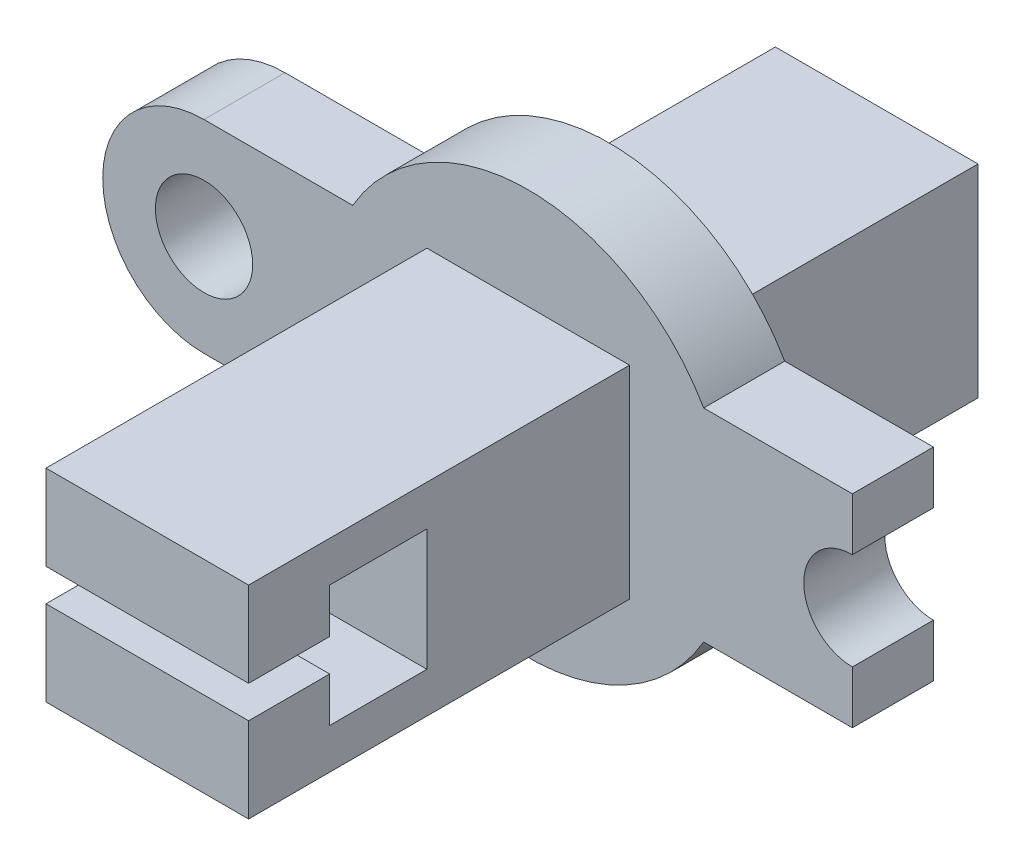
ISO-10303-21;
HEADER;
FILE_DESCRIPTION(('STEP AP214'),'2;1');
FILE_NAME('part.step','',(''),(''),'','','');
FILE_SCHEMA(('AUTOMOTIVE_DESIGN { 1 0 10303 214 1 1 1 1 }'));
ENDSEC;
DATA;
#1=APPLICATION_CONTEXT('core data for automotive mechanical design processes');
#2=APPLICATION_PROTOCOL_DEFINITION('international standard','automotive_design',2000,#1);
#3=PRODUCT_CONTEXT('',#1,'mechanical');
#4=PRODUCT('Part','Part','',(#3));
#5=PRODUCT_RELATED_PRODUCT_CATEGORY('part','',(#4));
#6=PRODUCT_DEFINITION_FORMATION('','',#4);
#7=PRODUCT_DEFINITION_CONTEXT('part definition',#1,'design');
#8=PRODUCT_DEFINITION('design','',#6,#7);
#9=PRODUCT_DEFINITION_SHAPE('','',#8);
#10=(LENGTH_UNIT() NAMED_UNIT(*) SI_UNIT(.MILLI.,.METRE.));
#11=(NAMED_UNIT(*) PLANE_ANGLE_UNIT() SI_UNIT($,.RADIAN.));
#12=(NAMED_UNIT(*) SI_UNIT($,.STERADIAN.) SOLID_ANGLE_UNIT());
#13=UNCERTAINTY_MEASURE_WITH_UNIT(LENGTH_MEASURE(1.E-05),#10,'distance_accuracy_value','');
#14=(GEOMETRIC_REPRESENTATION_CONTEXT(3) GLOBAL_UNCERTAINTY_ASSIGNED_CONTEXT((#13)) GLOBAL_UNIT_ASSIGNED_CONTEXT((#10,
#11,#12)) REPRESENTATION_CONTEXT('',''));
#15=CARTESIAN_POINT('',(0.,0.,0.));
#16=DIRECTION('',(0.,0.,1.));
#17=DIRECTION('',(1.,0.,0.));
#18=AXIS2_PLACEMENT_3D('',#15,#16,#17);
#19=CARTESIAN_POINT('',(0.,0.,90.));
#20=DIRECTION('',(0.,0.,1.));
#21=DIRECTION('',(1.,0.,0.));
#22=AXIS2_PLACEMENT_3D('',#19,#20,#21);
#23=PLANE('',#22);
#24=DIRECTION('',(0.,1.,0.));
#25=VECTOR('',#24,1.);
#26=CARTESIAN_POINT('',(12.5,0.,90.));
#27=LINE('',#26,#25);
#28=CARTESIAN_POINT('',(12.5,-12.5,90.));
#29=VERTEX_POINT('',#28);
#30=CARTESIAN_POINT('',(12.5,-2.,90.));
#31=VERTEX_POINT('',#30);
#32=EDGE_CURVE('E319',#29,#31,#27,.T.);
#33=ORIENTED_EDGE('',*,*,#32,.T.);
#34=DIRECTION('',(-1.,0.,0.));
#35=VECTOR('',#34,1.);
#36=CARTESIAN_POINT('',(0.,-2.,90.));
#37=LINE('',#36,#35);
#38=CARTESIAN_POINT('',(-12.5,-2.,90.));
#39=VERTEX_POINT('',#38);
#40=EDGE_CURVE('E349',#31,#39,#37,.T.);
#41=ORIENTED_EDGE('',*,*,#40,.T.);
#42=DIRECTION('',(0.,1.,0.));
#43=VECTOR('',#42,1.);
#44=CARTESIAN_POINT('',(-12.5,0.,90.));
#45=LINE('',#44,#43);
#46=CARTESIAN_POINT('',(-12.5,-12.5,90.));
#47=VERTEX_POINT('',#46);
#48=EDGE_CURVE('E315',#47,#39,#45,.T.);
#49=ORIENTED_EDGE('',*,*,#48,.F.);
#50=DIRECTION('',(1.,0.,0.));
#51=VECTOR('',#50,1.);
#52=CARTESIAN_POINT('',(0.,-12.5,90.));
#53=LINE('',#52,#51);
#54=EDGE_CURVE('E336',#47,#29,#53,.T.);
#55=ORIENTED_EDGE('',*,*,#54,.T.);
#56=EDGE_LOOP('',(#33,#41,#49,#55));
#57=FACE_BOUND('',#56,.T.);
#58=ADVANCED_FACE('F58',(#57),#23,.T.);
#59=CARTESIAN_POINT('',(0.,-12.5,90.));
#60=DIRECTION('',(0.,1.,0.));
#61=DIRECTION('',(0.,0.,1.));
#62=AXIS2_PLACEMENT_3D('',#59,#60,#61);
#63=PLANE('',#62);
#64=DIRECTION('',(0.,0.,-1.));
#65=VECTOR('',#64,1.);
#66=CARTESIAN_POINT('',(-12.5,-12.5,90.));
#67=LINE('',#66,#65);
#68=CARTESIAN_POINT('',(-12.5,-12.5,43.));
#69=VERTEX_POINT('',#68);
#70=EDGE_CURVE('E337',#47,#69,#67,.T.);
#71=ORIENTED_EDGE('',*,*,#70,.T.);
#72=DIRECTION('',(1.,0.,0.));
#73=VECTOR('',#72,1.);
#74=CARTESIAN_POINT('',(0.,-12.5,43.));
#75=LINE('',#74,#73);
#76=CARTESIAN_POINT('',(12.5,-12.5,43.));
#77=VERTEX_POINT('',#76);
#78=EDGE_CURVE('E81',#69,#77,#75,.T.);
#79=ORIENTED_EDGE('',*,*,#78,.T.);
#80=DIRECTION('',(0.,0.,-1.));
#81=VECTOR('',#80,1.);
#82=CARTESIAN_POINT('',(12.5,-12.5,90.));
#83=LINE('',#82,#81);
#84=EDGE_CURVE('E347',#29,#77,#83,.T.);
#85=ORIENTED_EDGE('',*,*,#84,.F.);
#86=ORIENTED_EDGE('',*,*,#54,.F.);
#87=EDGE_LOOP('',(#71,#79,#85,#86));
#88=FACE_BOUND('',#87,.T.);
#89=ADVANCED_FACE('F60',(#88),#63,.F.);
#90=CARTESIAN_POINT('',(12.5,0.,90.));
#91=DIRECTION('',(-1.,0.,0.));
#92=DIRECTION('',(0.,0.,1.));
#93=AXIS2_PLACEMENT_3D('',#90,#91,#92);
#94=PLANE('',#93);
#95=CARTESIAN_POINT('',(12.5,2.,90.));
#96=VERTEX_POINT('',#95);
#97=CARTESIAN_POINT('',(12.5,12.5,90.));
#98=VERTEX_POINT('',#97);
#99=EDGE_CURVE('E461',#96,#98,#27,.T.);
#100=ORIENTED_EDGE('',*,*,#99,.F.);
#101=DIRECTION('',(0.,0.,1.));
#102=VECTOR('',#101,1.);
#103=CARTESIAN_POINT('',(12.5,2.,80.));
#104=LINE('',#103,#102);
#105=CARTESIAN_POINT('',(12.5,2.,80.));
#106=VERTEX_POINT('',#105);
#107=EDGE_CURVE('E255',#106,#96,#104,.T.);
#108=ORIENTED_EDGE('',*,*,#107,.F.);
#109=DIRECTION('',(0.,-1.,0.));
#110=VECTOR('',#109,1.);
#111=CARTESIAN_POINT('',(12.5,7.5,80.));
#112=LINE('',#111,#110);
#113=CARTESIAN_POINT('',(12.5,7.5,80.));
#114=VERTEX_POINT('',#113);
#115=EDGE_CURVE('E238',#114,#106,#112,.T.);
#116=ORIENTED_EDGE('',*,*,#115,.F.);
#117=DIRECTION('',(0.,0.,1.));
#118=VECTOR('',#117,1.);
#119=CARTESIAN_POINT('',(12.5,7.5,68.));
#120=LINE('',#119,#118);
#121=CARTESIAN_POINT('',(12.5,7.5,68.));
#122=VERTEX_POINT('',#121);
#123=EDGE_CURVE('E247',#122,#114,#120,.T.);
#124=ORIENTED_EDGE('',*,*,#123,.F.);
#125=DIRECTION('',(0.,-1.,0.));
#126=VECTOR('',#125,1.);
#127=CARTESIAN_POINT('',(12.5,7.5,68.));
#128=LINE('',#127,#126);
#129=CARTESIAN_POINT('',(12.5,-7.5,68.));
#130=VERTEX_POINT('',#129);
#131=EDGE_CURVE('E244',#122,#130,#128,.T.);
#132=ORIENTED_EDGE('',*,*,#131,.T.);
#133=DIRECTION('',(0.,0.,1.));
#134=VECTOR('',#133,1.);
#135=CARTESIAN_POINT('',(12.5,-7.5,68.));
#136=LINE('',#135,#134);
#137=CARTESIAN_POINT('',(12.5,-7.5,80.));
#138=VERTEX_POINT('',#137);
#139=EDGE_CURVE('E259',#130,#138,#136,.T.);
#140=ORIENTED_EDGE('',*,*,#139,.T.);
#141=CARTESIAN_POINT('',(12.5,-2.,80.));
#142=VERTEX_POINT('',#141);
#143=EDGE_CURVE('E254',#142,#138,#112,.T.);
#144=ORIENTED_EDGE('',*,*,#143,.F.);
#145=DIRECTION('',(0.,0.,1.));
#146=VECTOR('',#145,1.);
#147=CARTESIAN_POINT('',(12.5,-2.,80.));
#148=LINE('',#147,#146);
#149=EDGE_CURVE('E351',#142,#31,#148,.T.);
#150=ORIENTED_EDGE('',*,*,#149,.T.);
#151=ORIENTED_EDGE('',*,*,#32,.F.);
#152=ORIENTED_EDGE('',*,*,#84,.T.);
#153=DIRECTION('',(0.,1.,0.));
#154=VECTOR('',#153,1.);
#155=CARTESIAN_POINT('',(12.5,0.,43.));
#156=LINE('',#155,#154);
#157=CARTESIAN_POINT('',(12.5,12.5,43.));
#158=VERTEX_POINT('',#157);
#159=EDGE_CURVE('E389',#77,#158,#156,.T.);
#160=ORIENTED_EDGE('',*,*,#159,.T.);
#161=DIRECTION('',(0.,0.,-1.));
#162=VECTOR('',#161,1.);
#163=CARTESIAN_POINT('',(12.5,12.5,90.));
#164=LINE('',#163,#162);
#165=EDGE_CURVE('E343',#98,#158,#164,.T.);
#166=ORIENTED_EDGE('',*,*,#165,.F.);
#167=EDGE_LOOP('',(#100,#108,#116,#124,#132,#140,#144,#150,#151,#152,#160,#166));
#168=FACE_BOUND('',#167,.T.);
#169=ADVANCED_FACE('F258',(#168),#94,.F.);
#170=CARTESIAN_POINT('',(0.,12.5,90.));
#171=DIRECTION('',(0.,1.,0.));
#172=DIRECTION('',(0.,0.,1.));
#173=AXIS2_PLACEMENT_3D('',#170,#171,#172);
#174=PLANE('',#173);
#175=DIRECTION('',(1.,0.,0.));
#176=VECTOR('',#175,1.);
#177=CARTESIAN_POINT('',(0.,12.5,43.));
#178=LINE('',#177,#176);
#179=CARTESIAN_POINT('',(-12.5,12.5,43.));
#180=VERTEX_POINT('',#179);
#181=EDGE_CURVE('E395',#180,#158,#178,.T.);
#182=ORIENTED_EDGE('',*,*,#181,.F.);
#183=DIRECTION('',(0.,0.,-1.));
#184=VECTOR('',#183,1.);
#185=CARTESIAN_POINT('',(-12.5,12.5,90.));
#186=LINE('',#185,#184);
#187=CARTESIAN_POINT('',(-12.5,12.5,90.));
#188=VERTEX_POINT('',#187);
#189=EDGE_CURVE('E340',#188,#180,#186,.T.);
#190=ORIENTED_EDGE('',*,*,#189,.F.);
#191=DIRECTION('',(1.,0.,0.));
#192=VECTOR('',#191,1.);
#193=CARTESIAN_POINT('',(0.,12.5,90.));
#194=LINE('',#193,#192);
#195=EDGE_CURVE('E314',#188,#98,#194,.T.);
#196=ORIENTED_EDGE('',*,*,#195,.T.);
#197=ORIENTED_EDGE('',*,*,#165,.T.);
#198=EDGE_LOOP('',(#182,#190,#196,#197));
#199=FACE_BOUND('',#198,.T.);
#200=ADVANCED_FACE('F468',(#199),#174,.T.);
#201=CARTESIAN_POINT('',(-12.5,0.,90.));
#202=DIRECTION('',(-1.,0.,0.));
#203=DIRECTION('',(0.,0.,1.));
#204=AXIS2_PLACEMENT_3D('',#201,#202,#203);
#205=PLANE('',#204);
#206=DIRECTION('',(0.,0.,-1.));
#207=VECTOR('',#206,1.);
#208=CARTESIAN_POINT('',(-12.5,2.,90.));
#209=LINE('',#208,#207);
#210=CARTESIAN_POINT('',(-12.5,2.,90.));
#211=VERTEX_POINT('',#210);
#212=CARTESIAN_POINT('',(-12.5,2.,80.));
#213=VERTEX_POINT('',#212);
#214=EDGE_CURVE('E302',#211,#213,#209,.T.);
#215=ORIENTED_EDGE('',*,*,#214,.F.);
#216=EDGE_CURVE('E304',#211,#188,#45,.T.);
#217=ORIENTED_EDGE('',*,*,#216,.T.);
#218=ORIENTED_EDGE('',*,*,#189,.T.);
#219=DIRECTION('',(0.,1.,0.));
#220=VECTOR('',#219,1.);
#221=CARTESIAN_POINT('',(-12.5,0.,43.));
#222=LINE('',#221,#220);
#223=EDGE_CURVE('E392',#69,#180,#222,.T.);
#224=ORIENTED_EDGE('',*,*,#223,.F.);
#225=ORIENTED_EDGE('',*,*,#70,.F.);
#226=ORIENTED_EDGE('',*,*,#48,.T.);
#227=DIRECTION('',(0.,0.,-1.));
#228=VECTOR('',#227,1.);
#229=CARTESIAN_POINT('',(-12.5,-2.,90.));
#230=LINE('',#229,#228);
#231=CARTESIAN_POINT('',(-12.5,-2.,80.));
#232=VERTEX_POINT('',#231);
#233=EDGE_CURVE('E73',#39,#232,#230,.T.);
#234=ORIENTED_EDGE('',*,*,#233,.T.);
#235=DIRECTION('',(0.,1.,0.));
#236=VECTOR('',#235,1.);
#237=CARTESIAN_POINT('',(-12.5,0.,80.));
#238=LINE('',#237,#236);
#239=CARTESIAN_POINT('',(-12.5,-7.5,80.));
#240=VERTEX_POINT('',#239);
#241=EDGE_CURVE('E296',#240,#232,#238,.T.);
#242=ORIENTED_EDGE('',*,*,#241,.F.);
#243=DIRECTION('',(0.,0.,-1.));
#244=VECTOR('',#243,1.);
#245=CARTESIAN_POINT('',(-12.5,-7.5,90.));
#246=LINE('',#245,#244);
#247=CARTESIAN_POINT('',(-12.5,-7.5,68.));
#248=VERTEX_POINT('',#247);
#249=EDGE_CURVE('E281',#240,#248,#246,.T.);
#250=ORIENTED_EDGE('',*,*,#249,.T.);
#251=DIRECTION('',(0.,1.,0.));
#252=VECTOR('',#251,1.);
#253=CARTESIAN_POINT('',(-12.5,0.,68.));
#254=LINE('',#253,#252);
#255=CARTESIAN_POINT('',(-12.5,7.5,68.));
#256=VERTEX_POINT('',#255);
#257=EDGE_CURVE('E292',#248,#256,#254,.T.);
#258=ORIENTED_EDGE('',*,*,#257,.T.);
#259=DIRECTION('',(0.,0.,-1.));
#260=VECTOR('',#259,1.);
#261=CARTESIAN_POINT('',(-12.5,7.5,90.));
#262=LINE('',#261,#260);
#263=CARTESIAN_POINT('',(-12.5,7.5,80.));
#264=VERTEX_POINT('',#263);
#265=EDGE_CURVE('E66',#264,#256,#262,.T.);
#266=ORIENTED_EDGE('',*,*,#265,.F.);
#267=DIRECTION('',(0.,1.,0.));
#268=VECTOR('',#267,1.);
#269=CARTESIAN_POINT('',(-12.5,0.,80.));
#270=LINE('',#269,#268);
#271=EDGE_CURVE('E12',#213,#264,#270,.T.);
#272=ORIENTED_EDGE('',*,*,#271,.F.);
#273=EDGE_LOOP('',(#215,#217,#218,#224,#225,#226,#234,#242,#250,#258,#266,#272));
#274=FACE_BOUND('',#273,.T.);
#275=ADVANCED_FACE('F295',(#274),#205,.T.);
#276=DIRECTION('',(-1.,0.,0.));
#277=VECTOR('',#276,1.);
#278=CARTESIAN_POINT('',(0.,2.,90.));
#279=LINE('',#278,#277);
#280=EDGE_CURVE('E299',#96,#211,#279,.T.);
#281=ORIENTED_EDGE('',*,*,#280,.F.);
#282=ORIENTED_EDGE('',*,*,#99,.T.);
#283=ORIENTED_EDGE('',*,*,#195,.F.);
#284=ORIENTED_EDGE('',*,*,#216,.F.);
#285=EDGE_LOOP('',(#281,#282,#283,#284));
#286=FACE_BOUND('',#285,.T.);
#287=ADVANCED_FACE('F312',(#286),#23,.T.);
#288=CARTESIAN_POINT('',(0.,-12.5,43.));
#289=DIRECTION('',(0.,1.,0.));
#290=DIRECTION('',(0.,0.,1.));
#291=AXIS2_PLACEMENT_3D('',#288,#289,#290);
#292=PLANE('',#291);
#293=DIRECTION('',(1.,0.,0.));
#294=VECTOR('',#293,1.);
#295=CARTESIAN_POINT('',(0.,-12.5,33.));
#296=LINE('',#295,#294);
#297=CARTESIAN_POINT('',(-40.,-12.5,33.));
#298=VERTEX_POINT('',#297);
#299=CARTESIAN_POINT('',(-21.650635094611,-12.5,33.));
#300=VERTEX_POINT('',#299);
#301=EDGE_CURVE('E307',#298,#300,#296,.T.);
#302=ORIENTED_EDGE('',*,*,#301,.T.);
#303=DIRECTION('',(0.,0.,-1.));
#304=VECTOR('',#303,1.);
#305=CARTESIAN_POINT('',(-21.650635094611,-12.5,43.));
#306=LINE('',#305,#304);
#307=CARTESIAN_POINT('',(-21.650635094611,-12.5,43.));
#308=VERTEX_POINT('',#307);
#309=EDGE_CURVE('E327',#308,#300,#306,.T.);
#310=ORIENTED_EDGE('',*,*,#309,.F.);
#311=DIRECTION('',(1.,0.,0.));
#312=VECTOR('',#311,1.);
#313=CARTESIAN_POINT('',(0.,-12.5,43.));
#314=LINE('',#313,#312);
#315=CARTESIAN_POINT('',(-40.,-12.5,43.));
#316=VERTEX_POINT('',#315);
#317=EDGE_CURVE('E365',#316,#308,#314,.T.);
#318=ORIENTED_EDGE('',*,*,#317,.F.);
#319=DIRECTION('',(0.,0.,-1.));
#320=VECTOR('',#319,1.);
#321=CARTESIAN_POINT('',(-40.,-12.5,43.));
#322=LINE('',#321,#320);
#323=EDGE_CURVE('E401',#316,#298,#322,.T.);
#324=ORIENTED_EDGE('',*,*,#323,.T.);
#325=EDGE_LOOP('',(#302,#310,#318,#324));
#326=FACE_BOUND('',#325,.T.);
#327=ADVANCED_FACE('F507',(#326),#292,.F.);
#328=CARTESIAN_POINT('',(0.,0.,43.));
#329=DIRECTION('',(0.,0.,-1.));
#330=DIRECTION('',(-1.,0.,0.));
#331=AXIS2_PLACEMENT_3D('',#328,#329,#330);
#332=CYLINDRICAL_SURFACE('',#331,25.);
#333=CARTESIAN_POINT('',(0.,0.,33.));
#334=DIRECTION('',(0.,0.,1.));
#335=DIRECTION('',(1.,0.,0.));
#336=AXIS2_PLACEMENT_3D('',#333,#334,#335);
#337=CIRCLE('',#336,25.);
#338=CARTESIAN_POINT('',(21.650635094611,-12.5,33.));
#339=VERTEX_POINT('',#338);
#340=EDGE_CURVE('E404',#300,#339,#337,.T.);
#341=ORIENTED_EDGE('',*,*,#340,.T.);
#342=DIRECTION('',(0.,0.,-1.));
#343=VECTOR('',#342,1.);
#344=CARTESIAN_POINT('',(21.650635094611,-12.5,43.));
#345=LINE('',#344,#343);
#346=CARTESIAN_POINT('',(21.650635094611,-12.5,43.));
#347=VERTEX_POINT('',#346);
#348=EDGE_CURVE('E456',#347,#339,#345,.T.);
#349=ORIENTED_EDGE('',*,*,#348,.F.);
#350=CARTESIAN_POINT('',(0.,0.,43.));
#351=DIRECTION('',(0.,0.,1.));
#352=DIRECTION('',(1.,0.,0.));
#353=AXIS2_PLACEMENT_3D('',#350,#351,#352);
#354=CIRCLE('',#353,25.);
#355=EDGE_CURVE('E368',#308,#347,#354,.T.);
#356=ORIENTED_EDGE('',*,*,#355,.F.);
#357=ORIENTED_EDGE('',*,*,#309,.T.);
#358=EDGE_LOOP('',(#341,#349,#356,#357));
#359=FACE_BOUND('',#358,.T.);
#360=ADVANCED_FACE('F512',(#359),#332,.T.);
#361=CARTESIAN_POINT('',(0.,-12.5,43.));
#362=DIRECTION('',(0.,-1.,0.));
#363=DIRECTION('',(0.,0.,-1.));
#364=AXIS2_PLACEMENT_3D('',#361,#362,#363);
#365=PLANE('',#364);
#366=DIRECTION('',(-1.,0.,0.));
#367=VECTOR('',#366,1.);
#368=CARTESIAN_POINT('',(0.,-12.5,33.));
#369=LINE('',#368,#367);
#370=CARTESIAN_POINT('',(40.,-12.5,33.));
#371=VERTEX_POINT('',#370);
#372=EDGE_CURVE('E407',#371,#339,#369,.T.);
#373=ORIENTED_EDGE('',*,*,#372,.F.);
#374=DIRECTION('',(0.,0.,-1.));
#375=VECTOR('',#374,1.);
#376=CARTESIAN_POINT('',(40.,-12.5,43.));
#377=LINE('',#376,#375);
#378=CARTESIAN_POINT('',(40.,-12.5,43.));
#379=VERTEX_POINT('',#378);
#380=EDGE_CURVE('E454',#379,#371,#377,.T.);
#381=ORIENTED_EDGE('',*,*,#380,.F.);
#382=DIRECTION('',(-1.,0.,0.));
#383=VECTOR('',#382,1.);
#384=CARTESIAN_POINT('',(0.,-12.5,43.));
#385=LINE('',#384,#383);
#386=EDGE_CURVE('E371',#379,#347,#385,.T.);
#387=ORIENTED_EDGE('',*,*,#386,.T.);
#388=ORIENTED_EDGE('',*,*,#348,.T.);
#389=EDGE_LOOP('',(#373,#381,#387,#388));
#390=FACE_BOUND('',#389,.T.);
#391=ADVANCED_FACE('F572',(#390),#365,.T.);
#392=CARTESIAN_POINT('',(40.,0.,43.));
#393=DIRECTION('',(1.,0.,0.));
#394=DIRECTION('',(0.,1.,0.));
#395=AXIS2_PLACEMENT_3D('',#392,#393,#394);
#396=PLANE('',#395);
#397=DIRECTION('',(0.,-1.,0.));
#398=VECTOR('',#397,1.);
#399=CARTESIAN_POINT('',(40.,0.,33.));
#400=LINE('',#399,#398);
#401=CARTESIAN_POINT('',(40.,-6.,33.));
#402=VERTEX_POINT('',#401);
#403=EDGE_CURVE('E411',#402,#371,#400,.T.);
#404=ORIENTED_EDGE('',*,*,#403,.F.);
#405=DIRECTION('',(0.,0.,-1.));
#406=VECTOR('',#405,1.);
#407=CARTESIAN_POINT('',(40.,-6.,43.));
#408=LINE('',#407,#406);
#409=CARTESIAN_POINT('',(40.,-6.,43.));
#410=VERTEX_POINT('',#409);
#411=EDGE_CURVE('E452',#410,#402,#408,.T.);
#412=ORIENTED_EDGE('',*,*,#411,.F.);
#413=DIRECTION('',(0.,-1.,0.));
#414=VECTOR('',#413,1.);
#415=CARTESIAN_POINT('',(40.,0.,43.));
#416=LINE('',#415,#414);
#417=EDGE_CURVE('E375',#410,#379,#416,.T.);
#418=ORIENTED_EDGE('',*,*,#417,.T.);
#419=ORIENTED_EDGE('',*,*,#380,.T.);
#420=EDGE_LOOP('',(#404,#412,#418,#419));
#421=FACE_BOUND('',#420,.T.);
#422=ADVANCED_FACE('F583',(#421),#396,.T.);
#423=CARTESIAN_POINT('',(40.,0.,43.));
#424=DIRECTION('',(0.,0.,-1.));
#425=DIRECTION('',(-1.,0.,0.));
#426=AXIS2_PLACEMENT_3D('',#423,#424,#425);
#427=CYLINDRICAL_SURFACE('',#426,5.99999999999999);
#428=CARTESIAN_POINT('',(40.,0.,33.));
#429=DIRECTION('',(0.,0.,1.));
#430=DIRECTION('',(1.,0.,0.));
#431=AXIS2_PLACEMENT_3D('',#428,#429,#430);
#432=CIRCLE('',#431,5.99999999999999);
#433=CARTESIAN_POINT('',(40.,6.,33.));
#434=VERTEX_POINT('',#433);
#435=EDGE_CURVE('E414',#402,#434,#432,.F.);
#436=ORIENTED_EDGE('',*,*,#435,.T.);
#437=DIRECTION('',(0.,0.,-1.));
#438=VECTOR('',#437,1.);
#439=CARTESIAN_POINT('',(40.,6.,43.));
#440=LINE('',#439,#438);
#441=CARTESIAN_POINT('',(40.,6.,43.));
#442=VERTEX_POINT('',#441);
#443=EDGE_CURVE('E449',#442,#434,#440,.T.);
#444=ORIENTED_EDGE('',*,*,#443,.F.);
#445=CARTESIAN_POINT('',(40.,0.,43.));
#446=DIRECTION('',(0.,0.,1.));
#447=DIRECTION('',(1.,0.,0.));
#448=AXIS2_PLACEMENT_3D('',#445,#446,#447);
#449=CIRCLE('',#448,5.99999999999999);
#450=EDGE_CURVE('E378',#410,#442,#449,.F.);
#451=ORIENTED_EDGE('',*,*,#450,.F.);
#452=ORIENTED_EDGE('',*,*,#411,.T.);
#453=EDGE_LOOP('',(#436,#444,#451,#452));
#454=FACE_BOUND('',#453,.T.);
#455=ADVANCED_FACE('F593',(#454),#427,.F.);
#456=CARTESIAN_POINT('',(40.,0.,43.));
#457=DIRECTION('',(-1.,0.,0.));
#458=DIRECTION('',(0.,-1.,0.));
#459=AXIS2_PLACEMENT_3D('',#456,#457,#458);
#460=PLANE('',#459);
#461=DIRECTION('',(0.,1.,0.));
#462=VECTOR('',#461,1.);
#463=CARTESIAN_POINT('',(40.,0.,33.));
#464=LINE('',#463,#462);
#465=CARTESIAN_POINT('',(40.,12.5,33.));
#466=VERTEX_POINT('',#465);
#467=EDGE_CURVE('E416',#434,#466,#464,.T.);
#468=ORIENTED_EDGE('',*,*,#467,.T.);
#469=DIRECTION('',(0.,0.,-1.));
#470=VECTOR('',#469,1.);
#471=CARTESIAN_POINT('',(40.,12.5,43.));
#472=LINE('',#471,#470);
#473=CARTESIAN_POINT('',(40.,12.5,43.));
#474=VERTEX_POINT('',#473);
#475=EDGE_CURVE('E446',#474,#466,#472,.T.);
#476=ORIENTED_EDGE('',*,*,#475,.F.);
#477=DIRECTION('',(0.,1.,0.));
#478=VECTOR('',#477,1.);
#479=CARTESIAN_POINT('',(40.,0.,43.));
#480=LINE('',#479,#478);
#481=EDGE_CURVE('E380',#442,#474,#480,.T.);
#482=ORIENTED_EDGE('',*,*,#481,.F.);
#483=ORIENTED_EDGE('',*,*,#443,.T.);
#484=EDGE_LOOP('',(#468,#476,#482,#483));
#485=FACE_BOUND('',#484,.T.);
#486=ADVANCED_FACE('F603',(#485),#460,.F.);
#487=CARTESIAN_POINT('',(0.,12.5,43.));
#488=DIRECTION('',(0.,-1.,0.));
#489=DIRECTION('',(1.,0.,0.));
#490=AXIS2_PLACEMENT_3D('',#487,#488,#489);
#491=PLANE('',#490);
#492=DIRECTION('',(-1.,0.,0.));
#493=VECTOR('',#492,1.);
#494=CARTESIAN_POINT('',(0.,12.5,33.));
#495=LINE('',#494,#493);
#496=CARTESIAN_POINT('',(21.650635094611,12.5,33.));
#497=VERTEX_POINT('',#496);
#498=EDGE_CURVE('E418',#466,#497,#495,.T.);
#499=ORIENTED_EDGE('',*,*,#498,.T.);
#500=DIRECTION('',(0.,0.,-1.));
#501=VECTOR('',#500,1.);
#502=CARTESIAN_POINT('',(21.650635094611,12.5,43.));
#503=LINE('',#502,#501);
#504=CARTESIAN_POINT('',(21.650635094611,12.5,43.));
#505=VERTEX_POINT('',#504);
#506=EDGE_CURVE('E443',#505,#497,#503,.T.);
#507=ORIENTED_EDGE('',*,*,#506,.F.);
#508=DIRECTION('',(-1.,0.,0.));
#509=VECTOR('',#508,1.);
#510=CARTESIAN_POINT('',(0.,12.5,43.));
#511=LINE('',#510,#509);
#512=EDGE_CURVE('E382',#474,#505,#511,.T.);
#513=ORIENTED_EDGE('',*,*,#512,.F.);
#514=ORIENTED_EDGE('',*,*,#475,.T.);
#515=EDGE_LOOP('',(#499,#507,#513,#514));
#516=FACE_BOUND('',#515,.T.);
#517=ADVANCED_FACE('F613',(#516),#491,.F.);
#518=CARTESIAN_POINT('',(-21.650635094611,12.5,33.));
#519=VERTEX_POINT('',#518);
#520=EDGE_CURVE('E408',#497,#519,#337,.T.);
#521=ORIENTED_EDGE('',*,*,#520,.T.);
#522=DIRECTION('',(0.,0.,-1.));
#523=VECTOR('',#522,1.);
#524=CARTESIAN_POINT('',(-21.650635094611,12.5,43.));
#525=LINE('',#524,#523);
#526=CARTESIAN_POINT('',(-21.650635094611,12.5,43.));
#527=VERTEX_POINT('',#526);
#528=EDGE_CURVE('E441',#527,#519,#525,.T.);
#529=ORIENTED_EDGE('',*,*,#528,.F.);
#530=EDGE_CURVE('E372',#505,#527,#354,.T.);
#531=ORIENTED_EDGE('',*,*,#530,.F.);
#532=ORIENTED_EDGE('',*,*,#506,.T.);
#533=EDGE_LOOP('',(#521,#529,#531,#532));
#534=FACE_BOUND('',#533,.T.);
#535=ADVANCED_FACE('F575',(#534),#332,.T.);
#536=CARTESIAN_POINT('',(0.,12.5,43.));
#537=DIRECTION('',(0.,1.,0.));
#538=DIRECTION('',(-1.,0.,0.));
#539=AXIS2_PLACEMENT_3D('',#536,#537,#538);
#540=PLANE('',#539);
#541=DIRECTION('',(1.,0.,0.));
#542=VECTOR('',#541,1.);
#543=CARTESIAN_POINT('',(0.,12.5,33.));
#544=LINE('',#543,#542);
#545=CARTESIAN_POINT('',(-40.,12.5,33.));
#546=VERTEX_POINT('',#545);
#547=EDGE_CURVE('E420',#546,#519,#544,.T.);
#548=ORIENTED_EDGE('',*,*,#547,.F.);
#549=DIRECTION('',(0.,0.,-1.));
#550=VECTOR('',#549,1.);
#551=CARTESIAN_POINT('',(-40.,12.5,43.));
#552=LINE('',#551,#550);
#553=CARTESIAN_POINT('',(-40.,12.5,43.));
#554=VERTEX_POINT('',#553);
#555=EDGE_CURVE('E439',#554,#546,#552,.T.);
#556=ORIENTED_EDGE('',*,*,#555,.F.);
#557=DIRECTION('',(1.,0.,0.));
#558=VECTOR('',#557,1.);
#559=CARTESIAN_POINT('',(0.,12.5,43.));
#560=LINE('',#559,#558);
#561=EDGE_CURVE('E384',#554,#527,#560,.T.);
#562=ORIENTED_EDGE('',*,*,#561,.T.);
#563=ORIENTED_EDGE('',*,*,#528,.T.);
#564=EDGE_LOOP('',(#548,#556,#562,#563));
#565=FACE_BOUND('',#564,.T.);
#566=ADVANCED_FACE('F632',(#565),#540,.T.);
#567=CARTESIAN_POINT('',(-40.,0.,43.));
#568=DIRECTION('',(0.,0.,-1.));
#569=DIRECTION('',(-1.,0.,0.));
#570=AXIS2_PLACEMENT_3D('',#567,#568,#569);
#571=CYLINDRICAL_SURFACE('',#570,12.5);
#572=CARTESIAN_POINT('',(-40.,0.,33.));
#573=DIRECTION('',(0.,0.,1.));
#574=DIRECTION('',(1.,0.,0.));
#575=AXIS2_PLACEMENT_3D('',#572,#573,#574);
#576=CIRCLE('',#575,12.5);
#577=EDGE_CURVE('E423',#546,#298,#576,.T.);
#578=ORIENTED_EDGE('',*,*,#577,.T.);
#579=ORIENTED_EDGE('',*,*,#323,.F.);
#580=CARTESIAN_POINT('',(-40.,0.,43.));
#581=DIRECTION('',(0.,0.,1.));
#582=DIRECTION('',(1.,0.,0.));
#583=AXIS2_PLACEMENT_3D('',#580,#581,#582);
#584=CIRCLE('',#583,12.5);
#585=EDGE_CURVE('E387',#554,#316,#584,.T.);
#586=ORIENTED_EDGE('',*,*,#585,.F.);
#587=ORIENTED_EDGE('',*,*,#555,.T.);
#588=EDGE_LOOP('',(#578,#579,#586,#587));
#589=FACE_BOUND('',#588,.T.);
#590=ADVANCED_FACE('F483',(#589),#571,.T.);
#591=CARTESIAN_POINT('',(-40.,0.,43.));
#592=DIRECTION('',(0.,0.,-1.));
#593=DIRECTION('',(-1.,0.,0.));
#594=AXIS2_PLACEMENT_3D('',#591,#592,#593);
#595=CYLINDRICAL_SURFACE('',#594,5.99999999999999);
#596=CARTESIAN_POINT('',(-40.,0.,43.));
#597=DIRECTION('',(0.,0.,1.));
#598=DIRECTION('',(1.,0.,0.));
#599=AXIS2_PLACEMENT_3D('',#596,#597,#598);
#600=CIRCLE('',#599,5.99999999999999);
#601=CARTESIAN_POINT('',(-34.,0.,43.));
#602=VERTEX_POINT('',#601);
#603=EDGE_CURVE('E398',#602,#602,#600,.T.);
#604=ORIENTED_EDGE('',*,*,#603,.T.);
#605=EDGE_LOOP('',(#604));
#606=FACE_BOUND('',#605,.T.);
#607=CARTESIAN_POINT('',(-40.,0.,33.));
#608=DIRECTION('',(0.,0.,1.));
#609=DIRECTION('',(1.,0.,0.));
#610=AXIS2_PLACEMENT_3D('',#607,#608,#609);
#611=CIRCLE('',#610,5.99999999999999);
#612=CARTESIAN_POINT('',(-34.,0.,33.));
#613=VERTEX_POINT('',#612);
#614=EDGE_CURVE('E369',#613,#613,#611,.T.);
#615=ORIENTED_EDGE('',*,*,#614,.F.);
#616=EDGE_LOOP('',(#615));
#617=FACE_BOUND('',#616,.T.);
#618=ADVANCED_FACE('F476',(#606,#617),#595,.F.);
#619=CARTESIAN_POINT('',(0.,0.,43.));
#620=DIRECTION('',(0.,0.,1.));
#621=DIRECTION('',(1.,0.,0.));
#622=AXIS2_PLACEMENT_3D('',#619,#620,#621);
#623=PLANE('',#622);
#624=ORIENTED_EDGE('',*,*,#317,.T.);
#625=ORIENTED_EDGE('',*,*,#355,.T.);
#626=ORIENTED_EDGE('',*,*,#386,.F.);
#627=ORIENTED_EDGE('',*,*,#417,.F.);
#628=ORIENTED_EDGE('',*,*,#450,.T.);
#629=ORIENTED_EDGE('',*,*,#481,.T.);
#630=ORIENTED_EDGE('',*,*,#512,.T.);
#631=ORIENTED_EDGE('',*,*,#530,.T.);
#632=ORIENTED_EDGE('',*,*,#561,.F.);
#633=ORIENTED_EDGE('',*,*,#585,.T.);
#634=EDGE_LOOP('',(#624,#625,#626,#627,#628,#629,#630,#631,#632,#633));
#635=FACE_BOUND('',#634,.T.);
#636=ORIENTED_EDGE('',*,*,#159,.F.);
#637=ORIENTED_EDGE('',*,*,#78,.F.);
#638=ORIENTED_EDGE('',*,*,#223,.T.);
#639=ORIENTED_EDGE('',*,*,#181,.T.);
#640=EDGE_LOOP('',(#636,#637,#638,#639));
#641=FACE_BOUND('',#640,.T.);
#642=ORIENTED_EDGE('',*,*,#603,.F.);
#643=EDGE_LOOP('',(#642));
#644=FACE_BOUND('',#643,.T.);
#645=ADVANCED_FACE('F472',(#635,#641,#644),#623,.T.);
#646=CARTESIAN_POINT('',(0.,0.,33.));
#647=DIRECTION('',(0.,0.,1.));
#648=DIRECTION('',(1.,0.,0.));
#649=AXIS2_PLACEMENT_3D('',#646,#647,#648);
#650=PLANE('',#649);
#651=ORIENTED_EDGE('',*,*,#301,.F.);
#652=ORIENTED_EDGE('',*,*,#577,.F.);
#653=ORIENTED_EDGE('',*,*,#547,.T.);
#654=ORIENTED_EDGE('',*,*,#520,.F.);
#655=ORIENTED_EDGE('',*,*,#498,.F.);
#656=ORIENTED_EDGE('',*,*,#467,.F.);
#657=ORIENTED_EDGE('',*,*,#435,.F.);
#658=ORIENTED_EDGE('',*,*,#403,.T.);
#659=ORIENTED_EDGE('',*,*,#372,.T.);
#660=ORIENTED_EDGE('',*,*,#340,.F.);
#661=EDGE_LOOP('',(#651,#652,#653,#654,#655,#656,#657,#658,#659,#660));
#662=FACE_BOUND('',#661,.T.);
#663=DIRECTION('',(0.,1.,0.));
#664=VECTOR('',#663,1.);
#665=CARTESIAN_POINT('',(12.5,0.,33.));
#666=LINE('',#665,#664);
#667=CARTESIAN_POINT('',(12.5,-12.5,33.));
#668=VERTEX_POINT('',#667);
#669=CARTESIAN_POINT('',(12.5,12.5,33.));
#670=VERTEX_POINT('',#669);
#671=EDGE_CURVE('E425',#668,#670,#666,.T.);
#672=ORIENTED_EDGE('',*,*,#671,.T.);
#673=DIRECTION('',(1.,0.,0.));
#674=VECTOR('',#673,1.);
#675=CARTESIAN_POINT('',(0.,12.5,33.));
#676=LINE('',#675,#674);
#677=CARTESIAN_POINT('',(-12.5,12.5,33.));
#678=VERTEX_POINT('',#677);
#679=EDGE_CURVE('E432',#678,#670,#676,.T.);
#680=ORIENTED_EDGE('',*,*,#679,.F.);
#681=DIRECTION('',(0.,1.,0.));
#682=VECTOR('',#681,1.);
#683=CARTESIAN_POINT('',(-12.5,0.,33.));
#684=LINE('',#683,#682);
#685=CARTESIAN_POINT('',(-12.5,-12.5,33.));
#686=VERTEX_POINT('',#685);
#687=EDGE_CURVE('E429',#686,#678,#684,.T.);
#688=ORIENTED_EDGE('',*,*,#687,.F.);
#689=DIRECTION('',(1.,0.,0.));
#690=VECTOR('',#689,1.);
#691=CARTESIAN_POINT('',(0.,-12.5,33.));
#692=LINE('',#691,#690);
#693=EDGE_CURVE('E427',#686,#668,#692,.T.);
#694=ORIENTED_EDGE('',*,*,#693,.T.);
#695=EDGE_LOOP('',(#672,#680,#688,#694));
#696=FACE_BOUND('',#695,.T.);
#697=ORIENTED_EDGE('',*,*,#614,.T.);
#698=EDGE_LOOP('',(#697));
#699=FACE_BOUND('',#698,.T.);
#700=ADVANCED_FACE('F475',(#662,#696,#699),#650,.F.);
#701=CARTESIAN_POINT('',(0.,0.,0.));
#702=DIRECTION('',(0.,0.,1.));
#703=DIRECTION('',(1.,0.,0.));
#704=AXIS2_PLACEMENT_3D('',#701,#702,#703);
#705=PLANE('',#704);
#706=DIRECTION('',(1.,0.,0.));
#707=VECTOR('',#706,1.);
#708=CARTESIAN_POINT('',(0.,-12.5,0.));
#709=LINE('',#708,#707);
#710=CARTESIAN_POINT('',(-12.5,-12.5,0.));
#711=VERTEX_POINT('',#710);
#712=CARTESIAN_POINT('',(12.5,-12.5,0.));
#713=VERTEX_POINT('',#712);
#714=EDGE_CURVE('E323',#711,#713,#709,.T.);
#715=ORIENTED_EDGE('',*,*,#714,.F.);
#716=DIRECTION('',(0.,1.,0.));
#717=VECTOR('',#716,1.);
#718=CARTESIAN_POINT('',(-12.5,0.,0.));
#719=LINE('',#718,#717);
#720=CARTESIAN_POINT('',(-12.5,12.5,0.));
#721=VERTEX_POINT('',#720);
#722=EDGE_CURVE('E333',#711,#721,#719,.T.);
#723=ORIENTED_EDGE('',*,*,#722,.T.);
#724=DIRECTION('',(1.,0.,0.));
#725=VECTOR('',#724,1.);
#726=CARTESIAN_POINT('',(0.,12.5,0.));
#727=LINE('',#726,#725);
#728=CARTESIAN_POINT('',(12.5,12.5,0.));
#729=VERTEX_POINT('',#728);
#730=EDGE_CURVE('E330',#721,#729,#727,.T.);
#731=ORIENTED_EDGE('',*,*,#730,.T.);
#732=DIRECTION('',(0.,1.,0.));
#733=VECTOR('',#732,1.);
#734=CARTESIAN_POINT('',(12.5,0.,0.));
#735=LINE('',#734,#733);
#736=EDGE_CURVE('E326',#713,#729,#735,.T.);
#737=ORIENTED_EDGE('',*,*,#736,.F.);
#738=EDGE_LOOP('',(#715,#723,#731,#737));
#739=FACE_BOUND('',#738,.T.);
#740=ADVANCED_FACE('F488',(#739),#705,.F.);
#741=EDGE_CURVE('E318',#686,#711,#67,.T.);
#742=ORIENTED_EDGE('',*,*,#741,.F.);
#743=ORIENTED_EDGE('',*,*,#687,.T.);
#744=EDGE_CURVE('E339',#678,#721,#186,.T.);
#745=ORIENTED_EDGE('',*,*,#744,.T.);
#746=ORIENTED_EDGE('',*,*,#722,.F.);
#747=EDGE_LOOP('',(#742,#743,#745,#746));
#748=FACE_BOUND('',#747,.T.);
#749=ADVANCED_FACE('F494',(#748),#205,.T.);
#750=ORIENTED_EDGE('',*,*,#744,.F.);
#751=ORIENTED_EDGE('',*,*,#679,.T.);
#752=EDGE_CURVE('E342',#670,#729,#164,.T.);
#753=ORIENTED_EDGE('',*,*,#752,.T.);
#754=ORIENTED_EDGE('',*,*,#730,.F.);
#755=EDGE_LOOP('',(#750,#751,#753,#754));
#756=FACE_BOUND('',#755,.T.);
#757=ADVANCED_FACE('F519',(#756),#174,.T.);
#758=ORIENTED_EDGE('',*,*,#671,.F.);
#759=EDGE_CURVE('E346',#668,#713,#83,.T.);
#760=ORIENTED_EDGE('',*,*,#759,.T.);
#761=ORIENTED_EDGE('',*,*,#736,.T.);
#762=ORIENTED_EDGE('',*,*,#752,.F.);
#763=EDGE_LOOP('',(#758,#760,#761,#762));
#764=FACE_BOUND('',#763,.T.);
#765=ADVANCED_FACE('F525',(#764),#94,.F.);
#766=ORIENTED_EDGE('',*,*,#693,.F.);
#767=ORIENTED_EDGE('',*,*,#741,.T.);
#768=ORIENTED_EDGE('',*,*,#714,.T.);
#769=ORIENTED_EDGE('',*,*,#759,.F.);
#770=EDGE_LOOP('',(#766,#767,#768,#769));
#771=FACE_BOUND('',#770,.T.);
#772=ADVANCED_FACE('F504',(#771),#63,.F.);
#773=CARTESIAN_POINT('',(-52.5,7.5,68.));
#774=DIRECTION('',(0.,0.,1.));
#775=DIRECTION('',(1.,0.,0.));
#776=AXIS2_PLACEMENT_3D('',#773,#774,#775);
#777=PLANE('',#776);
#778=DIRECTION('',(1.,0.,0.));
#779=VECTOR('',#778,1.);
#780=CARTESIAN_POINT('',(-52.5,-7.5,68.));
#781=LINE('',#780,#779);
#782=EDGE_CURVE('E274',#248,#130,#781,.T.);
#783=ORIENTED_EDGE('',*,*,#782,.T.);
#784=ORIENTED_EDGE('',*,*,#131,.F.);
#785=DIRECTION('',(1.,0.,0.));
#786=VECTOR('',#785,1.);
#787=CARTESIAN_POINT('',(-52.5,7.5,68.));
#788=LINE('',#787,#786);
#789=EDGE_CURVE('E250',#256,#122,#788,.T.);
#790=ORIENTED_EDGE('',*,*,#789,.F.);
#791=ORIENTED_EDGE('',*,*,#257,.F.);
#792=EDGE_LOOP('',(#783,#784,#790,#791));
#793=FACE_BOUND('',#792,.T.);
#794=ADVANCED_FACE('F290',(#793),#777,.T.);
#795=CARTESIAN_POINT('',(-52.5,-7.5,68.));
#796=DIRECTION('',(0.,1.,0.));
#797=DIRECTION('',(0.,0.,1.));
#798=AXIS2_PLACEMENT_3D('',#795,#796,#797);
#799=PLANE('',#798);
#800=DIRECTION('',(1.,0.,0.));
#801=VECTOR('',#800,1.);
#802=CARTESIAN_POINT('',(-52.5,-7.5,80.));
#803=LINE('',#802,#801);
#804=EDGE_CURVE('E243',#240,#138,#803,.T.);
#805=ORIENTED_EDGE('',*,*,#804,.T.);
#806=ORIENTED_EDGE('',*,*,#139,.F.);
#807=ORIENTED_EDGE('',*,*,#782,.F.);
#808=ORIENTED_EDGE('',*,*,#249,.F.);
#809=EDGE_LOOP('',(#805,#806,#807,#808));
#810=FACE_BOUND('',#809,.T.);
#811=ADVANCED_FACE('F278',(#810),#799,.T.);
#812=CARTESIAN_POINT('',(-52.5,7.5,68.));
#813=DIRECTION('',(0.,1.,0.));
#814=DIRECTION('',(0.,0.,1.));
#815=AXIS2_PLACEMENT_3D('',#812,#813,#814);
#816=PLANE('',#815);
#817=ORIENTED_EDGE('',*,*,#265,.T.);
#818=ORIENTED_EDGE('',*,*,#789,.T.);
#819=ORIENTED_EDGE('',*,*,#123,.T.);
#820=DIRECTION('',(1.,0.,0.));
#821=VECTOR('',#820,1.);
#822=CARTESIAN_POINT('',(-52.5,7.5,80.));
#823=LINE('',#822,#821);
#824=EDGE_CURVE('E233',#264,#114,#823,.T.);
#825=ORIENTED_EDGE('',*,*,#824,.F.);
#826=EDGE_LOOP('',(#817,#818,#819,#825));
#827=FACE_BOUND('',#826,.T.);
#828=ADVANCED_FACE('F248',(#827),#816,.F.);
#829=CARTESIAN_POINT('',(-52.5,7.5,80.));
#830=DIRECTION('',(0.,0.,1.));
#831=DIRECTION('',(1.,0.,0.));
#832=AXIS2_PLACEMENT_3D('',#829,#830,#831);
#833=PLANE('',#832);
#834=ORIENTED_EDGE('',*,*,#271,.T.);
#835=ORIENTED_EDGE('',*,*,#824,.T.);
#836=ORIENTED_EDGE('',*,*,#115,.T.);
#837=DIRECTION('',(1.,0.,0.));
#838=VECTOR('',#837,1.);
#839=CARTESIAN_POINT('',(-52.5,2.,80.));
#840=LINE('',#839,#838);
#841=EDGE_CURVE('E273',#213,#106,#840,.T.);
#842=ORIENTED_EDGE('',*,*,#841,.F.);
#843=EDGE_LOOP('',(#834,#835,#836,#842));
#844=FACE_BOUND('',#843,.T.);
#845=ADVANCED_FACE('F235',(#844),#833,.F.);
#846=ORIENTED_EDGE('',*,*,#241,.T.);
#847=DIRECTION('',(1.,0.,0.));
#848=VECTOR('',#847,1.);
#849=CARTESIAN_POINT('',(-52.5,-2.,80.));
#850=LINE('',#849,#848);
#851=EDGE_CURVE('E286',#232,#142,#850,.T.);
#852=ORIENTED_EDGE('',*,*,#851,.T.);
#853=ORIENTED_EDGE('',*,*,#143,.T.);
#854=ORIENTED_EDGE('',*,*,#804,.F.);
#855=EDGE_LOOP('',(#846,#852,#853,#854));
#856=FACE_BOUND('',#855,.T.);
#857=ADVANCED_FACE('F285',(#856),#833,.F.);
#858=CARTESIAN_POINT('',(-52.5,2.,80.));
#859=DIRECTION('',(0.,1.,0.));
#860=DIRECTION('',(0.,0.,1.));
#861=AXIS2_PLACEMENT_3D('',#858,#859,#860);
#862=PLANE('',#861);
#863=ORIENTED_EDGE('',*,*,#214,.T.);
#864=ORIENTED_EDGE('',*,*,#841,.T.);
#865=ORIENTED_EDGE('',*,*,#107,.T.);
#866=ORIENTED_EDGE('',*,*,#280,.T.);
#867=EDGE_LOOP('',(#863,#864,#865,#866));
#868=FACE_BOUND('',#867,.T.);
#869=ADVANCED_FACE('F350',(#868),#862,.F.);
#870=CARTESIAN_POINT('',(-52.5,-2.,80.));
#871=DIRECTION('',(0.,1.,0.));
#872=DIRECTION('',(0.,0.,1.));
#873=AXIS2_PLACEMENT_3D('',#870,#871,#872);
#874=PLANE('',#873);
#875=ORIENTED_EDGE('',*,*,#40,.F.);
#876=ORIENTED_EDGE('',*,*,#149,.F.);
#877=ORIENTED_EDGE('',*,*,#851,.F.);
#878=ORIENTED_EDGE('',*,*,#233,.F.);
#879=EDGE_LOOP('',(#875,#876,#877,#878));
#880=FACE_BOUND('',#879,.T.);
#881=ADVANCED_FACE('F732',(#880),#874,.T.);
#882=CLOSED_SHELL('',(#58,#89,#169,#200,#275,#287,#327,#360,#391,#422,#455,#486,#517,#535,#566,
#590,#618,#645,#700,#740,#749,#757,#765,#772,#794,#811,#828,#845,#857,#869,#881));
#883=MANIFOLD_SOLID_BREP('B2',#882);
#884=ADVANCED_BREP_SHAPE_REPRESENTATION('',(#18,#883),#14);
#885=SHAPE_DEFINITION_REPRESENTATION(#9,#884);
ENDSEC;
END-ISO-10303-21;
